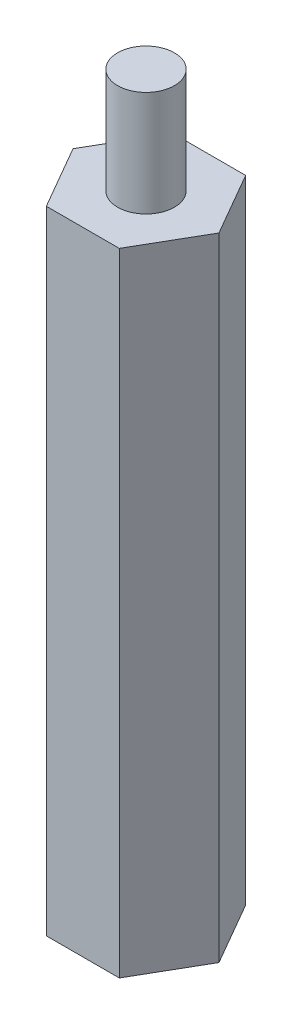
ISO-10303-21;
HEADER;
FILE_DESCRIPTION(('STEP AP214'),'2;1');
FILE_NAME('part.step','',(''),(''),'','','');
FILE_SCHEMA(('AUTOMOTIVE_DESIGN { 1 0 10303 214 1 1 1 1 }'));
ENDSEC;
DATA;
#1=APPLICATION_CONTEXT('core data for automotive mechanical design processes');
#2=APPLICATION_PROTOCOL_DEFINITION('international standard','automotive_design',2000,#1);
#3=PRODUCT_CONTEXT('',#1,'mechanical');
#4=PRODUCT('Part','Part','',(#3));
#5=PRODUCT_RELATED_PRODUCT_CATEGORY('part','',(#4));
#6=PRODUCT_DEFINITION_FORMATION('','',#4);
#7=PRODUCT_DEFINITION_CONTEXT('part definition',#1,'design');
#8=PRODUCT_DEFINITION('design','',#6,#7);
#9=PRODUCT_DEFINITION_SHAPE('','',#8);
#10=(LENGTH_UNIT() NAMED_UNIT(*) SI_UNIT(.MILLI.,.METRE.));
#11=(NAMED_UNIT(*) PLANE_ANGLE_UNIT() SI_UNIT($,.RADIAN.));
#12=(NAMED_UNIT(*) SI_UNIT($,.STERADIAN.) SOLID_ANGLE_UNIT());
#13=UNCERTAINTY_MEASURE_WITH_UNIT(LENGTH_MEASURE(1.E-05),#10,'distance_accuracy_value','');
#14=(GEOMETRIC_REPRESENTATION_CONTEXT(3) GLOBAL_UNCERTAINTY_ASSIGNED_CONTEXT((#13)) GLOBAL_UNIT_ASSIGNED_CONTEXT((#10,
#11,#12)) REPRESENTATION_CONTEXT('',''));
#15=CARTESIAN_POINT('',(0.,0.,0.));
#16=DIRECTION('',(0.,0.,1.));
#17=DIRECTION('',(1.,0.,0.));
#18=AXIS2_PLACEMENT_3D('',#15,#16,#17);
#19=CARTESIAN_POINT('',(1.73205080756891,30.,2.99999999999998));
#20=DIRECTION('',(-0.866025403784442,0.,-0.499999999999995));
#21=DIRECTION('',(-0.499999999999995,0.,0.866025403784442));
#22=AXIS2_PLACEMENT_3D('',#19,#20,#21);
#23=PLANE('',#22);
#24=DIRECTION('',(0.499999999999995,0.,-0.866025403784442));
#25=VECTOR('',#24,1.);
#26=CARTESIAN_POINT('',(1.73205080756891,0.,2.99999999999998));
#27=LINE('',#26,#25);
#28=CARTESIAN_POINT('',(1.73205080756891,0.,2.99999999999998));
#29=VERTEX_POINT('',#28);
#30=CARTESIAN_POINT('',(3.46410161513776,0.,0.));
#31=VERTEX_POINT('',#30);
#32=EDGE_CURVE('E130',#29,#31,#27,.T.);
#33=ORIENTED_EDGE('',*,*,#32,.T.);
#34=DIRECTION('',(0.,-1.,0.));
#35=VECTOR('',#34,1.);
#36=CARTESIAN_POINT('',(3.46410161513776,30.,0.));
#37=LINE('',#36,#35);
#38=CARTESIAN_POINT('',(3.46410161513776,30.,0.));
#39=VERTEX_POINT('',#38);
#40=EDGE_CURVE('E42',#39,#31,#37,.T.);
#41=ORIENTED_EDGE('',*,*,#40,.F.);
#42=DIRECTION('',(0.499999999999995,0.,-0.866025403784442));
#43=VECTOR('',#42,1.);
#44=CARTESIAN_POINT('',(1.73205080756891,30.,2.99999999999998));
#45=LINE('',#44,#43);
#46=CARTESIAN_POINT('',(1.73205080756891,30.,2.99999999999998));
#47=VERTEX_POINT('',#46);
#48=EDGE_CURVE('E147',#47,#39,#45,.T.);
#49=ORIENTED_EDGE('',*,*,#48,.F.);
#50=DIRECTION('',(0.,-1.,0.));
#51=VECTOR('',#50,1.);
#52=CARTESIAN_POINT('',(1.73205080756891,30.,2.99999999999998));
#53=LINE('',#52,#51);
#54=EDGE_CURVE('E126',#47,#29,#53,.T.);
#55=ORIENTED_EDGE('',*,*,#54,.T.);
#56=EDGE_LOOP('',(#33,#41,#49,#55));
#57=FACE_BOUND('',#56,.T.);
#58=ADVANCED_FACE('F39',(#57),#23,.F.);
#59=CARTESIAN_POINT('',(3.46410161513776,30.,0.));
#60=DIRECTION('',(-0.866025403784438,0.,0.500000000000001));
#61=DIRECTION('',(0.500000000000001,0.,0.866025403784438));
#62=AXIS2_PLACEMENT_3D('',#59,#60,#61);
#63=PLANE('',#62);
#64=DIRECTION('',(-0.500000000000001,0.,-0.866025403784438));
#65=VECTOR('',#64,1.);
#66=CARTESIAN_POINT('',(3.46410161513776,0.,0.));
#67=LINE('',#66,#65);
#68=CARTESIAN_POINT('',(1.73205080756887,0.,-3.00000000000001));
#69=VERTEX_POINT('',#68);
#70=EDGE_CURVE('E134',#31,#69,#67,.T.);
#71=ORIENTED_EDGE('',*,*,#70,.T.);
#72=DIRECTION('',(0.,-1.,0.));
#73=VECTOR('',#72,1.);
#74=CARTESIAN_POINT('',(1.73205080756887,30.,-3.00000000000001));
#75=LINE('',#74,#73);
#76=CARTESIAN_POINT('',(1.73205080756887,30.,-3.00000000000001));
#77=VERTEX_POINT('',#76);
#78=EDGE_CURVE('E153',#77,#69,#75,.T.);
#79=ORIENTED_EDGE('',*,*,#78,.F.);
#80=DIRECTION('',(-0.500000000000001,0.,-0.866025403784438));
#81=VECTOR('',#80,1.);
#82=CARTESIAN_POINT('',(3.46410161513776,30.,0.));
#83=LINE('',#82,#81);
#84=EDGE_CURVE('E95',#39,#77,#83,.T.);
#85=ORIENTED_EDGE('',*,*,#84,.F.);
#86=ORIENTED_EDGE('',*,*,#40,.T.);
#87=EDGE_LOOP('',(#71,#79,#85,#86));
#88=FACE_BOUND('',#87,.T.);
#89=ADVANCED_FACE('F160',(#88),#63,.F.);
#90=CARTESIAN_POINT('',(1.73205080756887,30.,-3.00000000000001));
#91=DIRECTION('',(0.,0.,1.));
#92=DIRECTION('',(1.,0.,0.));
#93=AXIS2_PLACEMENT_3D('',#90,#91,#92);
#94=PLANE('',#93);
#95=DIRECTION('',(-1.,0.,0.));
#96=VECTOR('',#95,1.);
#97=CARTESIAN_POINT('',(1.73205080756887,0.,-3.00000000000001));
#98=LINE('',#97,#96);
#99=CARTESIAN_POINT('',(-1.73205080756889,0.,-2.99999999999999));
#100=VERTEX_POINT('',#99);
#101=EDGE_CURVE('E138',#69,#100,#98,.T.);
#102=ORIENTED_EDGE('',*,*,#101,.T.);
#103=DIRECTION('',(0.,-1.,0.));
#104=VECTOR('',#103,1.);
#105=CARTESIAN_POINT('',(-1.73205080756889,30.,-2.99999999999999));
#106=LINE('',#105,#104);
#107=CARTESIAN_POINT('',(-1.73205080756889,30.,-2.99999999999999));
#108=VERTEX_POINT('',#107);
#109=EDGE_CURVE('E119',#108,#100,#106,.T.);
#110=ORIENTED_EDGE('',*,*,#109,.F.);
#111=DIRECTION('',(-1.,0.,0.));
#112=VECTOR('',#111,1.);
#113=CARTESIAN_POINT('',(1.73205080756887,30.,-3.00000000000001));
#114=LINE('',#113,#112);
#115=EDGE_CURVE('E108',#77,#108,#114,.T.);
#116=ORIENTED_EDGE('',*,*,#115,.F.);
#117=ORIENTED_EDGE('',*,*,#78,.T.);
#118=EDGE_LOOP('',(#102,#110,#116,#117));
#119=FACE_BOUND('',#118,.T.);
#120=ADVANCED_FACE('F166',(#119),#94,.F.);
#121=CARTESIAN_POINT('',(-1.73205080756889,30.,-2.99999999999999));
#122=DIRECTION('',(0.866025403784441,0.,0.499999999999995));
#123=DIRECTION('',(0.499999999999995,0.,-0.866025403784442));
#124=AXIS2_PLACEMENT_3D('',#121,#122,#123);
#125=PLANE('',#124);
#126=DIRECTION('',(-0.499999999999995,0.,0.866025403784442));
#127=VECTOR('',#126,1.);
#128=CARTESIAN_POINT('',(-1.73205080756889,0.,-2.99999999999999));
#129=LINE('',#128,#127);
#130=CARTESIAN_POINT('',(-3.46410161513776,0.,0.));
#131=VERTEX_POINT('',#130);
#132=EDGE_CURVE('E117',#100,#131,#129,.T.);
#133=ORIENTED_EDGE('',*,*,#132,.T.);
#134=DIRECTION('',(0.,-1.,0.));
#135=VECTOR('',#134,1.);
#136=CARTESIAN_POINT('',(-3.46410161513776,30.,0.));
#137=LINE('',#136,#135);
#138=CARTESIAN_POINT('',(-3.46410161513776,30.,0.));
#139=VERTEX_POINT('',#138);
#140=EDGE_CURVE('E114',#139,#131,#137,.T.);
#141=ORIENTED_EDGE('',*,*,#140,.F.);
#142=DIRECTION('',(-0.499999999999995,0.,0.866025403784442));
#143=VECTOR('',#142,1.);
#144=CARTESIAN_POINT('',(-1.73205080756889,30.,-2.99999999999999));
#145=LINE('',#144,#143);
#146=EDGE_CURVE('E102',#108,#139,#145,.T.);
#147=ORIENTED_EDGE('',*,*,#146,.F.);
#148=ORIENTED_EDGE('',*,*,#109,.T.);
#149=EDGE_LOOP('',(#133,#141,#147,#148));
#150=FACE_BOUND('',#149,.T.);
#151=ADVANCED_FACE('F115',(#150),#125,.F.);
#152=CARTESIAN_POINT('',(-3.46410161513776,30.,0.));
#153=DIRECTION('',(0.866025403784435,0.,-0.500000000000007));
#154=DIRECTION('',(-0.500000000000007,0.,-0.866025403784435));
#155=AXIS2_PLACEMENT_3D('',#152,#153,#154);
#156=PLANE('',#155);
#157=DIRECTION('',(0.500000000000007,0.,0.866025403784434));
#158=VECTOR('',#157,1.);
#159=CARTESIAN_POINT('',(-3.46410161513776,0.,0.));
#160=LINE('',#159,#158);
#161=CARTESIAN_POINT('',(-1.73205080756885,0.,3.00000000000002));
#162=VERTEX_POINT('',#161);
#163=EDGE_CURVE('E80',#131,#162,#160,.T.);
#164=ORIENTED_EDGE('',*,*,#163,.T.);
#165=DIRECTION('',(0.,-1.,0.));
#166=VECTOR('',#165,1.);
#167=CARTESIAN_POINT('',(-1.73205080756885,30.,3.00000000000002));
#168=LINE('',#167,#166);
#169=CARTESIAN_POINT('',(-1.73205080756885,30.,3.00000000000002));
#170=VERTEX_POINT('',#169);
#171=EDGE_CURVE('E120',#170,#162,#168,.T.);
#172=ORIENTED_EDGE('',*,*,#171,.F.);
#173=DIRECTION('',(0.500000000000007,0.,0.866025403784434));
#174=VECTOR('',#173,1.);
#175=CARTESIAN_POINT('',(-3.46410161513776,30.,0.));
#176=LINE('',#175,#174);
#177=EDGE_CURVE('E106',#139,#170,#176,.T.);
#178=ORIENTED_EDGE('',*,*,#177,.F.);
#179=ORIENTED_EDGE('',*,*,#140,.T.);
#180=EDGE_LOOP('',(#164,#172,#178,#179));
#181=FACE_BOUND('',#180,.T.);
#182=ADVANCED_FACE('F122',(#181),#156,.F.);
#183=CARTESIAN_POINT('',(-1.73205080756885,30.,3.00000000000002));
#184=DIRECTION('',(0.,0.,-1.));
#185=DIRECTION('',(-1.,0.,0.));
#186=AXIS2_PLACEMENT_3D('',#183,#184,#185);
#187=PLANE('',#186);
#188=DIRECTION('',(1.,0.,0.));
#189=VECTOR('',#188,1.);
#190=CARTESIAN_POINT('',(-1.73205080756885,0.,3.00000000000002));
#191=LINE('',#190,#189);
#192=EDGE_CURVE('E86',#162,#29,#191,.T.);
#193=ORIENTED_EDGE('',*,*,#192,.T.);
#194=ORIENTED_EDGE('',*,*,#54,.F.);
#195=DIRECTION('',(1.,0.,0.));
#196=VECTOR('',#195,1.);
#197=CARTESIAN_POINT('',(-1.73205080756885,30.,3.00000000000002));
#198=LINE('',#197,#196);
#199=EDGE_CURVE('E57',#170,#47,#198,.T.);
#200=ORIENTED_EDGE('',*,*,#199,.F.);
#201=ORIENTED_EDGE('',*,*,#171,.T.);
#202=EDGE_LOOP('',(#193,#194,#200,#201));
#203=FACE_BOUND('',#202,.T.);
#204=ADVANCED_FACE('F203',(#203),#187,.F.);
#205=CARTESIAN_POINT('',(0.,30.,0.));
#206=DIRECTION('',(0.,1.,0.));
#207=DIRECTION('',(0.,0.,1.));
#208=AXIS2_PLACEMENT_3D('',#205,#206,#207);
#209=PLANE('',#208);
#210=CARTESIAN_POINT('',(0.,30.,0.));
#211=DIRECTION('',(0.,1.,0.));
#212=DIRECTION('',(0.,0.,1.));
#213=AXIS2_PLACEMENT_3D('',#210,#211,#212);
#214=CIRCLE('',#213,1.35);
#215=CARTESIAN_POINT('',(0.,30.,1.35));
#216=VERTEX_POINT('',#215);
#217=EDGE_CURVE('E11',#216,#216,#214,.T.);
#218=ORIENTED_EDGE('',*,*,#217,.F.);
#219=EDGE_LOOP('',(#218));
#220=FACE_BOUND('',#219,.T.);
#221=ORIENTED_EDGE('',*,*,#48,.T.);
#222=ORIENTED_EDGE('',*,*,#84,.T.);
#223=ORIENTED_EDGE('',*,*,#115,.T.);
#224=ORIENTED_EDGE('',*,*,#146,.T.);
#225=ORIENTED_EDGE('',*,*,#177,.T.);
#226=ORIENTED_EDGE('',*,*,#199,.T.);
#227=EDGE_LOOP('',(#221,#222,#223,#224,#225,#226));
#228=FACE_BOUND('',#227,.T.);
#229=ADVANCED_FACE('F104',(#220,#228),#209,.T.);
#230=CARTESIAN_POINT('',(0.,0.,0.));
#231=DIRECTION('',(0.,1.,0.));
#232=DIRECTION('',(0.,0.,1.));
#233=AXIS2_PLACEMENT_3D('',#230,#231,#232);
#234=PLANE('',#233);
#235=CARTESIAN_POINT('',(0.,0.,0.));
#236=DIRECTION('',(0.,-1.,0.));
#237=DIRECTION('',(0.,0.,-1.));
#238=AXIS2_PLACEMENT_3D('',#235,#236,#237);
#239=CIRCLE('',#238,1.35);
#240=CARTESIAN_POINT('',(0.,0.,-1.35));
#241=VERTEX_POINT('',#240);
#242=EDGE_CURVE('E177',#241,#241,#239,.T.);
#243=ORIENTED_EDGE('',*,*,#242,.F.);
#244=EDGE_LOOP('',(#243));
#245=FACE_BOUND('',#244,.T.);
#246=ORIENTED_EDGE('',*,*,#32,.F.);
#247=ORIENTED_EDGE('',*,*,#192,.F.);
#248=ORIENTED_EDGE('',*,*,#163,.F.);
#249=ORIENTED_EDGE('',*,*,#132,.F.);
#250=ORIENTED_EDGE('',*,*,#101,.F.);
#251=ORIENTED_EDGE('',*,*,#70,.F.);
#252=EDGE_LOOP('',(#246,#247,#248,#249,#250,#251));
#253=FACE_BOUND('',#252,.T.);
#254=ADVANCED_FACE('F165',(#245,#253),#234,.F.);
#255=CARTESIAN_POINT('',(0.,35.,0.));
#256=DIRECTION('',(0.,-1.,0.));
#257=DIRECTION('',(0.,0.,-1.));
#258=AXIS2_PLACEMENT_3D('',#255,#256,#257);
#259=CYLINDRICAL_SURFACE('',#258,1.35);
#260=CARTESIAN_POINT('',(0.,35.,0.));
#261=DIRECTION('',(0.,1.,0.));
#262=DIRECTION('',(0.,0.,1.));
#263=AXIS2_PLACEMENT_3D('',#260,#261,#262);
#264=CIRCLE('',#263,1.35);
#265=CARTESIAN_POINT('',(0.,35.,1.35));
#266=VERTEX_POINT('',#265);
#267=EDGE_CURVE('E135',#266,#266,#264,.T.);
#268=ORIENTED_EDGE('',*,*,#267,.F.);
#269=EDGE_LOOP('',(#268));
#270=FACE_BOUND('',#269,.T.);
#271=ORIENTED_EDGE('',*,*,#217,.T.);
#272=EDGE_LOOP('',(#271));
#273=FACE_BOUND('',#272,.T.);
#274=ADVANCED_FACE('F195',(#270,#273),#259,.T.);
#275=CARTESIAN_POINT('',(0.,35.,0.));
#276=DIRECTION('',(0.,1.,0.));
#277=DIRECTION('',(0.,0.,1.));
#278=AXIS2_PLACEMENT_3D('',#275,#276,#277);
#279=PLANE('',#278);
#280=ORIENTED_EDGE('',*,*,#267,.T.);
#281=EDGE_LOOP('',(#280));
#282=FACE_BOUND('',#281,.T.);
#283=ADVANCED_FACE('F190',(#282),#279,.T.);
#284=CARTESIAN_POINT('',(0.,6.,0.));
#285=DIRECTION('',(0.,-1.,0.));
#286=DIRECTION('',(0.,0.,-1.));
#287=AXIS2_PLACEMENT_3D('',#284,#285,#286);
#288=CYLINDRICAL_SURFACE('',#287,1.35);
#289=CARTESIAN_POINT('',(0.,6.,0.));
#290=DIRECTION('',(0.,-1.,0.));
#291=DIRECTION('',(0.,0.,-1.));
#292=AXIS2_PLACEMENT_3D('',#289,#290,#291);
#293=CIRCLE('',#292,1.35);
#294=CARTESIAN_POINT('',(0.,6.,-1.35));
#295=VERTEX_POINT('',#294);
#296=EDGE_CURVE('E176',#295,#295,#293,.T.);
#297=ORIENTED_EDGE('',*,*,#296,.F.);
#298=EDGE_LOOP('',(#297));
#299=FACE_BOUND('',#298,.T.);
#300=ORIENTED_EDGE('',*,*,#242,.T.);
#301=EDGE_LOOP('',(#300));
#302=FACE_BOUND('',#301,.T.);
#303=ADVANCED_FACE('F187',(#299,#302),#288,.F.);
#304=CARTESIAN_POINT('',(0.,6.,0.));
#305=DIRECTION('',(0.,-1.,0.));
#306=DIRECTION('',(0.,0.,-1.));
#307=AXIS2_PLACEMENT_3D('',#304,#305,#306);
#308=PLANE('',#307);
#309=ORIENTED_EDGE('',*,*,#296,.T.);
#310=EDGE_LOOP('',(#309));
#311=FACE_BOUND('',#310,.T.);
#312=ADVANCED_FACE('F185',(#311),#308,.T.);
#313=CLOSED_SHELL('',(#58,#89,#120,#151,#182,#204,#229,#254,#274,#283,#303,#312));
#314=MANIFOLD_SOLID_BREP('B2',#313);
#315=ADVANCED_BREP_SHAPE_REPRESENTATION('',(#18,#314),#14);
#316=SHAPE_DEFINITION_REPRESENTATION(#9,#315);
ENDSEC;
END-ISO-10303-21;
